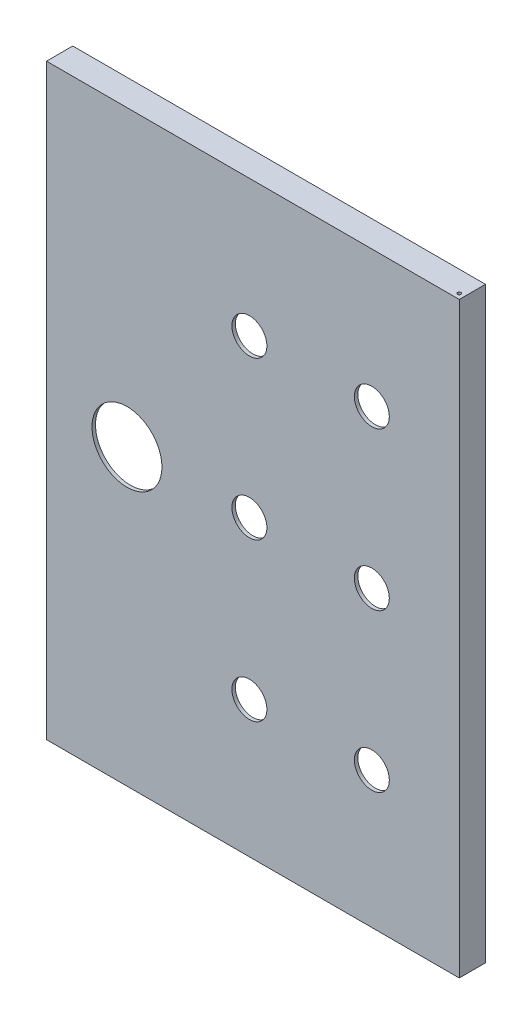
ISO-10303-21;
HEADER;
FILE_DESCRIPTION(('STEP AP214'),'2;1');
FILE_NAME('part.step','',(''),(''),'','','');
FILE_SCHEMA(('AUTOMOTIVE_DESIGN { 1 0 10303 214 1 1 1 1 }'));
ENDSEC;
DATA;
#1=APPLICATION_CONTEXT('core data for automotive mechanical design processes');
#2=APPLICATION_PROTOCOL_DEFINITION('international standard','automotive_design',2000,#1);
#3=PRODUCT_CONTEXT('',#1,'mechanical');
#4=PRODUCT('Part','Part','',(#3));
#5=PRODUCT_RELATED_PRODUCT_CATEGORY('part','',(#4));
#6=PRODUCT_DEFINITION_FORMATION('','',#4);
#7=PRODUCT_DEFINITION_CONTEXT('part definition',#1,'design');
#8=PRODUCT_DEFINITION('design','',#6,#7);
#9=PRODUCT_DEFINITION_SHAPE('','',#8);
#10=(LENGTH_UNIT() NAMED_UNIT(*) SI_UNIT(.MILLI.,.METRE.));
#11=(NAMED_UNIT(*) PLANE_ANGLE_UNIT() SI_UNIT($,.RADIAN.));
#12=(NAMED_UNIT(*) SI_UNIT($,.STERADIAN.) SOLID_ANGLE_UNIT());
#13=UNCERTAINTY_MEASURE_WITH_UNIT(LENGTH_MEASURE(1.E-05),#10,'distance_accuracy_value','');
#14=(GEOMETRIC_REPRESENTATION_CONTEXT(3) GLOBAL_UNCERTAINTY_ASSIGNED_CONTEXT((#13)) GLOBAL_UNIT_ASSIGNED_CONTEXT((#10,
#11,#12)) REPRESENTATION_CONTEXT('',''));
#15=CARTESIAN_POINT('',(0.,0.,0.));
#16=DIRECTION('',(0.,0.,1.));
#17=DIRECTION('',(1.,0.,0.));
#18=AXIS2_PLACEMENT_3D('',#15,#16,#17);
#19=CARTESIAN_POINT('',(-118.,166.,15.));
#20=DIRECTION('',(0.,-1.,0.));
#21=DIRECTION('',(0.,0.,-1.));
#22=AXIS2_PLACEMENT_3D('',#19,#20,#21);
#23=PLANE('',#22);
#24=CARTESIAN_POINT('',(115.,166.,12.));
#25=DIRECTION('',(0.,-1.,0.));
#26=DIRECTION('',(0.,0.,-1.));
#27=AXIS2_PLACEMENT_3D('',#24,#25,#26);
#28=CIRCLE('',#27,0.999999999999998);
#29=CARTESIAN_POINT('',(116.,166.,12.));
#30=VERTEX_POINT('',#29);
#31=CARTESIAN_POINT('',(115.,166.,13.));
#32=VERTEX_POINT('',#31);
#33=EDGE_CURVE('E49',#30,#32,#28,.T.);
#34=ORIENTED_EDGE('',*,*,#33,.F.);
#35=DIRECTION('',(0.,0.,-1.));
#36=VECTOR('',#35,1.);
#37=CARTESIAN_POINT('',(116.,166.,15.));
#38=LINE('',#37,#36);
#39=CARTESIAN_POINT('',(116.,166.,13.));
#40=VERTEX_POINT('',#39);
#41=EDGE_CURVE('E166',#40,#30,#38,.T.);
#42=ORIENTED_EDGE('',*,*,#41,.F.);
#43=DIRECTION('',(-1.,0.,0.));
#44=VECTOR('',#43,1.);
#45=CARTESIAN_POINT('',(-118.,166.,13.));
#46=LINE('',#45,#44);
#47=EDGE_CURVE('E173',#40,#32,#46,.T.);
#48=ORIENTED_EDGE('',*,*,#47,.T.);
#49=EDGE_LOOP('',(#34,#42,#48));
#50=FACE_BOUND('',#49,.T.);
#51=ADVANCED_FACE('F35',(#50),#23,.T.);
#52=CARTESIAN_POINT('',(-118.,-166.,15.));
#53=DIRECTION('',(0.,1.,0.));
#54=DIRECTION('',(-1.,0.,0.));
#55=AXIS2_PLACEMENT_3D('',#52,#53,#54);
#56=PLANE('',#55);
#57=CARTESIAN_POINT('',(115.,-166.,12.));
#58=DIRECTION('',(0.,1.,0.));
#59=DIRECTION('',(-1.,0.,0.));
#60=AXIS2_PLACEMENT_3D('',#57,#58,#59);
#61=CIRCLE('',#60,0.999999999999998);
#62=CARTESIAN_POINT('',(115.,-166.,13.));
#63=VERTEX_POINT('',#62);
#64=CARTESIAN_POINT('',(116.,-166.,12.));
#65=VERTEX_POINT('',#64);
#66=EDGE_CURVE('E11',#63,#65,#61,.T.);
#67=ORIENTED_EDGE('',*,*,#66,.F.);
#68=DIRECTION('',(1.,0.,0.));
#69=VECTOR('',#68,1.);
#70=CARTESIAN_POINT('',(-118.,-166.,13.));
#71=LINE('',#70,#69);
#72=CARTESIAN_POINT('',(116.,-166.,13.));
#73=VERTEX_POINT('',#72);
#74=EDGE_CURVE('E141',#63,#73,#71,.T.);
#75=ORIENTED_EDGE('',*,*,#74,.T.);
#76=DIRECTION('',(0.,0.,-1.));
#77=VECTOR('',#76,1.);
#78=CARTESIAN_POINT('',(116.,-166.,15.));
#79=LINE('',#78,#77);
#80=EDGE_CURVE('E144',#73,#65,#79,.T.);
#81=ORIENTED_EDGE('',*,*,#80,.T.);
#82=EDGE_LOOP('',(#67,#75,#81));
#83=FACE_BOUND('',#82,.T.);
#84=ADVANCED_FACE('F140',(#83),#56,.T.);
#85=CARTESIAN_POINT('',(-118.,-168.,15.));
#86=DIRECTION('',(0.,1.,0.));
#87=DIRECTION('',(-1.,0.,0.));
#88=AXIS2_PLACEMENT_3D('',#85,#86,#87);
#89=PLANE('',#88);
#90=CARTESIAN_POINT('',(115.,-168.,12.));
#91=DIRECTION('',(0.,1.,0.));
#92=DIRECTION('',(0.,0.,1.));
#93=AXIS2_PLACEMENT_3D('',#90,#91,#92);
#94=CIRCLE('',#93,0.999999999999998);
#95=CARTESIAN_POINT('',(115.,-168.,13.));
#96=VERTEX_POINT('',#95);
#97=EDGE_CURVE('E264',#96,#96,#94,.T.);
#98=ORIENTED_EDGE('',*,*,#97,.T.);
#99=EDGE_LOOP('',(#98));
#100=FACE_BOUND('',#99,.T.);
#101=DIRECTION('',(1.,0.,0.));
#102=VECTOR('',#101,1.);
#103=CARTESIAN_POINT('',(-118.,-168.,0.));
#104=LINE('',#103,#102);
#105=CARTESIAN_POINT('',(-118.,-168.,0.));
#106=VERTEX_POINT('',#105);
#107=CARTESIAN_POINT('',(118.,-168.,0.));
#108=VERTEX_POINT('',#107);
#109=EDGE_CURVE('E188',#106,#108,#104,.T.);
#110=ORIENTED_EDGE('',*,*,#109,.T.);
#111=DIRECTION('',(0.,0.,-1.));
#112=VECTOR('',#111,1.);
#113=CARTESIAN_POINT('',(118.,-168.,15.));
#114=LINE('',#113,#112);
#115=CARTESIAN_POINT('',(118.,-168.,15.));
#116=VERTEX_POINT('',#115);
#117=EDGE_CURVE('E136',#116,#108,#114,.T.);
#118=ORIENTED_EDGE('',*,*,#117,.F.);
#119=DIRECTION('',(1.,0.,0.));
#120=VECTOR('',#119,1.);
#121=CARTESIAN_POINT('',(-118.,-168.,15.));
#122=LINE('',#121,#120);
#123=CARTESIAN_POINT('',(-118.,-168.,15.));
#124=VERTEX_POINT('',#123);
#125=EDGE_CURVE('E177',#124,#116,#122,.T.);
#126=ORIENTED_EDGE('',*,*,#125,.F.);
#127=DIRECTION('',(0.,0.,-1.));
#128=VECTOR('',#127,1.);
#129=CARTESIAN_POINT('',(-118.,-168.,15.));
#130=LINE('',#129,#128);
#131=EDGE_CURVE('E187',#124,#106,#130,.T.);
#132=ORIENTED_EDGE('',*,*,#131,.T.);
#133=EDGE_LOOP('',(#110,#118,#126,#132));
#134=FACE_BOUND('',#133,.T.);
#135=ADVANCED_FACE('F37',(#100,#134),#89,.F.);
#136=CARTESIAN_POINT('',(118.,-168.,15.));
#137=DIRECTION('',(-1.,0.,0.));
#138=DIRECTION('',(0.,0.,1.));
#139=AXIS2_PLACEMENT_3D('',#136,#137,#138);
#140=PLANE('',#139);
#141=DIRECTION('',(0.,1.,0.));
#142=VECTOR('',#141,1.);
#143=CARTESIAN_POINT('',(118.,-168.,0.));
#144=LINE('',#143,#142);
#145=CARTESIAN_POINT('',(118.,168.,0.));
#146=VERTEX_POINT('',#145);
#147=EDGE_CURVE('E191',#108,#146,#144,.T.);
#148=ORIENTED_EDGE('',*,*,#147,.T.);
#149=DIRECTION('',(0.,0.,-1.));
#150=VECTOR('',#149,1.);
#151=CARTESIAN_POINT('',(118.,168.,15.));
#152=LINE('',#151,#150);
#153=CARTESIAN_POINT('',(118.,168.,15.));
#154=VERTEX_POINT('',#153);
#155=EDGE_CURVE('E201',#154,#146,#152,.T.);
#156=ORIENTED_EDGE('',*,*,#155,.F.);
#157=DIRECTION('',(0.,1.,0.));
#158=VECTOR('',#157,1.);
#159=CARTESIAN_POINT('',(118.,-168.,15.));
#160=LINE('',#159,#158);
#161=EDGE_CURVE('E180',#116,#154,#160,.T.);
#162=ORIENTED_EDGE('',*,*,#161,.F.);
#163=ORIENTED_EDGE('',*,*,#117,.T.);
#164=EDGE_LOOP('',(#148,#156,#162,#163));
#165=FACE_BOUND('',#164,.T.);
#166=ADVANCED_FACE('F206',(#165),#140,.F.);
#167=CARTESIAN_POINT('',(-118.,168.,15.));
#168=DIRECTION('',(0.,-1.,0.));
#169=DIRECTION('',(0.,0.,-1.));
#170=AXIS2_PLACEMENT_3D('',#167,#168,#169);
#171=PLANE('',#170);
#172=CARTESIAN_POINT('',(115.,168.,12.));
#173=DIRECTION('',(0.,-1.,0.));
#174=DIRECTION('',(0.,0.,-1.));
#175=AXIS2_PLACEMENT_3D('',#172,#173,#174);
#176=CIRCLE('',#175,0.999999999999998);
#177=CARTESIAN_POINT('',(115.,168.,11.));
#178=VERTEX_POINT('',#177);
#179=EDGE_CURVE('E305',#178,#178,#176,.T.);
#180=ORIENTED_EDGE('',*,*,#179,.T.);
#181=EDGE_LOOP('',(#180));
#182=FACE_BOUND('',#181,.T.);
#183=DIRECTION('',(-1.,0.,0.));
#184=VECTOR('',#183,1.);
#185=CARTESIAN_POINT('',(-118.,168.,0.));
#186=LINE('',#185,#184);
#187=CARTESIAN_POINT('',(-118.,168.,0.));
#188=VERTEX_POINT('',#187);
#189=EDGE_CURVE('E193',#146,#188,#186,.T.);
#190=ORIENTED_EDGE('',*,*,#189,.T.);
#191=DIRECTION('',(0.,0.,-1.));
#192=VECTOR('',#191,1.);
#193=CARTESIAN_POINT('',(-118.,168.,15.));
#194=LINE('',#193,#192);
#195=CARTESIAN_POINT('',(-118.,168.,15.));
#196=VERTEX_POINT('',#195);
#197=EDGE_CURVE('E198',#196,#188,#194,.T.);
#198=ORIENTED_EDGE('',*,*,#197,.F.);
#199=DIRECTION('',(-1.,0.,0.));
#200=VECTOR('',#199,1.);
#201=CARTESIAN_POINT('',(-118.,168.,15.));
#202=LINE('',#201,#200);
#203=EDGE_CURVE('E183',#154,#196,#202,.T.);
#204=ORIENTED_EDGE('',*,*,#203,.F.);
#205=ORIENTED_EDGE('',*,*,#155,.T.);
#206=EDGE_LOOP('',(#190,#198,#204,#205));
#207=FACE_BOUND('',#206,.T.);
#208=ADVANCED_FACE('F219',(#182,#207),#171,.F.);
#209=CARTESIAN_POINT('',(-118.,-168.,15.));
#210=DIRECTION('',(1.,0.,0.));
#211=DIRECTION('',(0.,0.,-1.));
#212=AXIS2_PLACEMENT_3D('',#209,#210,#211);
#213=PLANE('',#212);
#214=DIRECTION('',(0.,-1.,0.));
#215=VECTOR('',#214,1.);
#216=CARTESIAN_POINT('',(-118.,-168.,0.));
#217=LINE('',#216,#215);
#218=EDGE_CURVE('E181',#188,#106,#217,.T.);
#219=ORIENTED_EDGE('',*,*,#218,.T.);
#220=ORIENTED_EDGE('',*,*,#131,.F.);
#221=DIRECTION('',(0.,-1.,0.));
#222=VECTOR('',#221,1.);
#223=CARTESIAN_POINT('',(-118.,-168.,15.));
#224=LINE('',#223,#222);
#225=EDGE_CURVE('E185',#196,#124,#224,.T.);
#226=ORIENTED_EDGE('',*,*,#225,.F.);
#227=ORIENTED_EDGE('',*,*,#197,.T.);
#228=EDGE_LOOP('',(#219,#220,#226,#227));
#229=FACE_BOUND('',#228,.T.);
#230=ADVANCED_FACE('F223',(#229),#213,.F.);
#231=CARTESIAN_POINT('',(0.,0.,15.));
#232=DIRECTION('',(0.,0.,1.));
#233=DIRECTION('',(1.,0.,0.));
#234=AXIS2_PLACEMENT_3D('',#231,#232,#233);
#235=PLANE('',#234);
#236=CARTESIAN_POINT('',(68.,-90.0000000000001,15.));
#237=DIRECTION('',(0.,0.,1.));
#238=DIRECTION('',(1.,0.,0.));
#239=AXIS2_PLACEMENT_3D('',#236,#237,#238);
#240=CIRCLE('',#239,9.99999999999999);
#241=CARTESIAN_POINT('',(78.,-90.0000000000001,15.));
#242=VERTEX_POINT('',#241);
#243=EDGE_CURVE('E342',#242,#242,#240,.T.);
#244=ORIENTED_EDGE('',*,*,#243,.F.);
#245=EDGE_LOOP('',(#244));
#246=FACE_BOUND('',#245,.T.);
#247=CARTESIAN_POINT('',(-1.99999999999997,-90.0000000000001,15.));
#248=DIRECTION('',(0.,0.,1.));
#249=DIRECTION('',(1.,0.,0.));
#250=AXIS2_PLACEMENT_3D('',#247,#248,#249);
#251=CIRCLE('',#250,10.);
#252=CARTESIAN_POINT('',(8.00000000000003,-90.0000000000001,15.));
#253=VERTEX_POINT('',#252);
#254=EDGE_CURVE('E348',#253,#253,#251,.T.);
#255=ORIENTED_EDGE('',*,*,#254,.F.);
#256=EDGE_LOOP('',(#255));
#257=FACE_BOUND('',#256,.T.);
#258=CARTESIAN_POINT('',(68.,89.9999999999999,15.));
#259=DIRECTION('',(0.,0.,1.));
#260=DIRECTION('',(1.,0.,0.));
#261=AXIS2_PLACEMENT_3D('',#258,#259,#260);
#262=CIRCLE('',#261,9.99999999999999);
#263=CARTESIAN_POINT('',(78.,89.9999999999999,15.));
#264=VERTEX_POINT('',#263);
#265=EDGE_CURVE('E354',#264,#264,#262,.T.);
#266=ORIENTED_EDGE('',*,*,#265,.F.);
#267=EDGE_LOOP('',(#266));
#268=FACE_BOUND('',#267,.T.);
#269=CARTESIAN_POINT('',(-1.99999999999997,0.,15.));
#270=DIRECTION('',(0.,0.,1.));
#271=DIRECTION('',(1.,0.,0.));
#272=AXIS2_PLACEMENT_3D('',#269,#270,#271);
#273=CIRCLE('',#272,10.);
#274=CARTESIAN_POINT('',(8.00000000000003,0.,15.));
#275=VERTEX_POINT('',#274);
#276=EDGE_CURVE('E324',#275,#275,#273,.T.);
#277=ORIENTED_EDGE('',*,*,#276,.F.);
#278=EDGE_LOOP('',(#277));
#279=FACE_BOUND('',#278,.T.);
#280=CARTESIAN_POINT('',(68.,0.,15.));
#281=DIRECTION('',(0.,0.,1.));
#282=DIRECTION('',(1.,0.,0.));
#283=AXIS2_PLACEMENT_3D('',#280,#281,#282);
#284=CIRCLE('',#283,9.99999999999999);
#285=CARTESIAN_POINT('',(78.,0.,15.));
#286=VERTEX_POINT('',#285);
#287=EDGE_CURVE('E337',#286,#286,#284,.T.);
#288=ORIENTED_EDGE('',*,*,#287,.F.);
#289=EDGE_LOOP('',(#288));
#290=FACE_BOUND('',#289,.T.);
#291=CARTESIAN_POINT('',(-1.99999999999997,89.9999999999999,15.));
#292=DIRECTION('',(0.,0.,1.));
#293=DIRECTION('',(1.,0.,0.));
#294=AXIS2_PLACEMENT_3D('',#291,#292,#293);
#295=CIRCLE('',#294,10.);
#296=CARTESIAN_POINT('',(8.00000000000003,89.9999999999999,15.));
#297=VERTEX_POINT('',#296);
#298=EDGE_CURVE('E330',#297,#297,#295,.T.);
#299=ORIENTED_EDGE('',*,*,#298,.F.);
#300=EDGE_LOOP('',(#299));
#301=FACE_BOUND('',#300,.T.);
#302=CARTESIAN_POINT('',(-72.,0.,15.));
#303=DIRECTION('',(0.,0.,1.));
#304=DIRECTION('',(1.,0.,0.));
#305=AXIS2_PLACEMENT_3D('',#302,#303,#304);
#306=CIRCLE('',#305,20.);
#307=CARTESIAN_POINT('',(-52.,0.,15.));
#308=VERTEX_POINT('',#307);
#309=EDGE_CURVE('E318',#308,#308,#306,.T.);
#310=ORIENTED_EDGE('',*,*,#309,.F.);
#311=EDGE_LOOP('',(#310));
#312=FACE_BOUND('',#311,.T.);
#313=ORIENTED_EDGE('',*,*,#125,.T.);
#314=ORIENTED_EDGE('',*,*,#161,.T.);
#315=ORIENTED_EDGE('',*,*,#203,.T.);
#316=ORIENTED_EDGE('',*,*,#225,.T.);
#317=EDGE_LOOP('',(#313,#314,#315,#316));
#318=FACE_BOUND('',#317,.T.);
#319=ADVANCED_FACE('F225',(#246,#257,#268,#279,#290,#301,#312,#318),#235,.T.);
#320=CARTESIAN_POINT('',(0.,0.,0.));
#321=DIRECTION('',(0.,0.,1.));
#322=DIRECTION('',(1.,0.,0.));
#323=AXIS2_PLACEMENT_3D('',#320,#321,#322);
#324=PLANE('',#323);
#325=ORIENTED_EDGE('',*,*,#109,.F.);
#326=ORIENTED_EDGE('',*,*,#218,.F.);
#327=ORIENTED_EDGE('',*,*,#189,.F.);
#328=ORIENTED_EDGE('',*,*,#147,.F.);
#329=EDGE_LOOP('',(#325,#326,#327,#328));
#330=FACE_BOUND('',#329,.T.);
#331=DIRECTION('',(0.,1.,0.));
#332=VECTOR('',#331,1.);
#333=CARTESIAN_POINT('',(108.,-158.,0.));
#334=LINE('',#333,#332);
#335=CARTESIAN_POINT('',(108.,-158.,0.));
#336=VERTEX_POINT('',#335);
#337=CARTESIAN_POINT('',(108.,158.,0.));
#338=VERTEX_POINT('',#337);
#339=EDGE_CURVE('E302',#336,#338,#334,.T.);
#340=ORIENTED_EDGE('',*,*,#339,.T.);
#341=DIRECTION('',(-1.,0.,0.));
#342=VECTOR('',#341,1.);
#343=CARTESIAN_POINT('',(108.,158.,0.));
#344=LINE('',#343,#342);
#345=CARTESIAN_POINT('',(-108.,158.,0.));
#346=VERTEX_POINT('',#345);
#347=EDGE_CURVE('E299',#338,#346,#344,.T.);
#348=ORIENTED_EDGE('',*,*,#347,.T.);
#349=DIRECTION('',(0.,-1.,0.));
#350=VECTOR('',#349,1.);
#351=CARTESIAN_POINT('',(-108.,158.,0.));
#352=LINE('',#351,#350);
#353=CARTESIAN_POINT('',(-108.,-158.,0.));
#354=VERTEX_POINT('',#353);
#355=EDGE_CURVE('E296',#346,#354,#352,.T.);
#356=ORIENTED_EDGE('',*,*,#355,.T.);
#357=DIRECTION('',(1.,0.,0.));
#358=VECTOR('',#357,1.);
#359=CARTESIAN_POINT('',(-108.,-158.,0.));
#360=LINE('',#359,#358);
#361=EDGE_CURVE('E292',#354,#336,#360,.T.);
#362=ORIENTED_EDGE('',*,*,#361,.T.);
#363=EDGE_LOOP('',(#340,#348,#356,#362));
#364=FACE_BOUND('',#363,.T.);
#365=ADVANCED_FACE('F214',(#330,#364),#324,.F.);
#366=CARTESIAN_POINT('',(0.,0.,2.));
#367=DIRECTION('',(0.,0.,1.));
#368=DIRECTION('',(1.,0.,0.));
#369=AXIS2_PLACEMENT_3D('',#366,#367,#368);
#370=PLANE('',#369);
#371=DIRECTION('',(-1.,0.,0.));
#372=VECTOR('',#371,1.);
#373=CARTESIAN_POINT('',(116.,166.,2.));
#374=LINE('',#373,#372);
#375=CARTESIAN_POINT('',(116.,166.,2.));
#376=VERTEX_POINT('',#375);
#377=CARTESIAN_POINT('',(-116.,166.,2.));
#378=VERTEX_POINT('',#377);
#379=EDGE_CURVE('E277',#376,#378,#374,.T.);
#380=ORIENTED_EDGE('',*,*,#379,.T.);
#381=DIRECTION('',(0.,-1.,0.));
#382=VECTOR('',#381,1.);
#383=CARTESIAN_POINT('',(-116.,166.,2.));
#384=LINE('',#383,#382);
#385=CARTESIAN_POINT('',(-116.,-166.,2.));
#386=VERTEX_POINT('',#385);
#387=EDGE_CURVE('E275',#378,#386,#384,.T.);
#388=ORIENTED_EDGE('',*,*,#387,.T.);
#389=DIRECTION('',(1.,0.,0.));
#390=VECTOR('',#389,1.);
#391=CARTESIAN_POINT('',(-116.,-166.,2.));
#392=LINE('',#391,#390);
#393=CARTESIAN_POINT('',(116.,-166.,2.));
#394=VERTEX_POINT('',#393);
#395=EDGE_CURVE('E269',#386,#394,#392,.T.);
#396=ORIENTED_EDGE('',*,*,#395,.T.);
#397=DIRECTION('',(0.,1.,0.));
#398=VECTOR('',#397,1.);
#399=CARTESIAN_POINT('',(116.,-166.,2.));
#400=LINE('',#399,#398);
#401=EDGE_CURVE('E152',#394,#376,#400,.T.);
#402=ORIENTED_EDGE('',*,*,#401,.T.);
#403=EDGE_LOOP('',(#380,#388,#396,#402));
#404=FACE_BOUND('',#403,.T.);
#405=DIRECTION('',(-1.,0.,0.));
#406=VECTOR('',#405,1.);
#407=CARTESIAN_POINT('',(108.,158.,2.));
#408=LINE('',#407,#406);
#409=CARTESIAN_POINT('',(108.,158.,2.));
#410=VERTEX_POINT('',#409);
#411=CARTESIAN_POINT('',(-108.,158.,2.));
#412=VERTEX_POINT('',#411);
#413=EDGE_CURVE('E310',#410,#412,#408,.T.);
#414=ORIENTED_EDGE('',*,*,#413,.F.);
#415=DIRECTION('',(0.,1.,0.));
#416=VECTOR('',#415,1.);
#417=CARTESIAN_POINT('',(108.,-158.,2.));
#418=LINE('',#417,#416);
#419=CARTESIAN_POINT('',(108.,-158.,2.));
#420=VERTEX_POINT('',#419);
#421=EDGE_CURVE('E295',#420,#410,#418,.T.);
#422=ORIENTED_EDGE('',*,*,#421,.F.);
#423=DIRECTION('',(1.,0.,0.));
#424=VECTOR('',#423,1.);
#425=CARTESIAN_POINT('',(-108.,-158.,2.));
#426=LINE('',#425,#424);
#427=CARTESIAN_POINT('',(-108.,-158.,2.));
#428=VERTEX_POINT('',#427);
#429=EDGE_CURVE('E291',#428,#420,#426,.T.);
#430=ORIENTED_EDGE('',*,*,#429,.F.);
#431=DIRECTION('',(0.,-1.,0.));
#432=VECTOR('',#431,1.);
#433=CARTESIAN_POINT('',(-108.,158.,2.));
#434=LINE('',#433,#432);
#435=EDGE_CURVE('E307',#412,#428,#434,.T.);
#436=ORIENTED_EDGE('',*,*,#435,.F.);
#437=EDGE_LOOP('',(#414,#422,#430,#436));
#438=FACE_BOUND('',#437,.T.);
#439=ADVANCED_FACE('F233',(#404,#438),#370,.T.);
#440=CARTESIAN_POINT('',(108.,-158.,2.));
#441=DIRECTION('',(-1.,0.,0.));
#442=DIRECTION('',(0.,0.,1.));
#443=AXIS2_PLACEMENT_3D('',#440,#441,#442);
#444=PLANE('',#443);
#445=ORIENTED_EDGE('',*,*,#339,.F.);
#446=DIRECTION('',(0.,0.,-1.));
#447=VECTOR('',#446,1.);
#448=CARTESIAN_POINT('',(108.,-158.,2.));
#449=LINE('',#448,#447);
#450=EDGE_CURVE('E288',#420,#336,#449,.T.);
#451=ORIENTED_EDGE('',*,*,#450,.F.);
#452=ORIENTED_EDGE('',*,*,#421,.T.);
#453=DIRECTION('',(0.,0.,-1.));
#454=VECTOR('',#453,1.);
#455=CARTESIAN_POINT('',(108.,158.,2.));
#456=LINE('',#455,#454);
#457=EDGE_CURVE('E281',#410,#338,#456,.T.);
#458=ORIENTED_EDGE('',*,*,#457,.T.);
#459=EDGE_LOOP('',(#445,#451,#452,#458));
#460=FACE_BOUND('',#459,.T.);
#461=ADVANCED_FACE('F408',(#460),#444,.T.);
#462=CARTESIAN_POINT('',(108.,158.,2.));
#463=DIRECTION('',(0.,-1.,0.));
#464=DIRECTION('',(0.,0.,-1.));
#465=AXIS2_PLACEMENT_3D('',#462,#463,#464);
#466=PLANE('',#465);
#467=ORIENTED_EDGE('',*,*,#347,.F.);
#468=ORIENTED_EDGE('',*,*,#457,.F.);
#469=ORIENTED_EDGE('',*,*,#413,.T.);
#470=DIRECTION('',(0.,0.,-1.));
#471=VECTOR('',#470,1.);
#472=CARTESIAN_POINT('',(-108.,158.,2.));
#473=LINE('',#472,#471);
#474=EDGE_CURVE('E284',#412,#346,#473,.T.);
#475=ORIENTED_EDGE('',*,*,#474,.T.);
#476=EDGE_LOOP('',(#467,#468,#469,#475));
#477=FACE_BOUND('',#476,.T.);
#478=ADVANCED_FACE('F404',(#477),#466,.T.);
#479=CARTESIAN_POINT('',(-108.,158.,2.));
#480=DIRECTION('',(1.,0.,0.));
#481=DIRECTION('',(0.,0.,-1.));
#482=AXIS2_PLACEMENT_3D('',#479,#480,#481);
#483=PLANE('',#482);
#484=ORIENTED_EDGE('',*,*,#355,.F.);
#485=ORIENTED_EDGE('',*,*,#474,.F.);
#486=ORIENTED_EDGE('',*,*,#435,.T.);
#487=DIRECTION('',(0.,0.,-1.));
#488=VECTOR('',#487,1.);
#489=CARTESIAN_POINT('',(-108.,-158.,2.));
#490=LINE('',#489,#488);
#491=EDGE_CURVE('E286',#428,#354,#490,.T.);
#492=ORIENTED_EDGE('',*,*,#491,.T.);
#493=EDGE_LOOP('',(#484,#485,#486,#492));
#494=FACE_BOUND('',#493,.T.);
#495=ADVANCED_FACE('F400',(#494),#483,.T.);
#496=CARTESIAN_POINT('',(-108.,-158.,2.));
#497=DIRECTION('',(0.,1.,0.));
#498=DIRECTION('',(0.,0.,1.));
#499=AXIS2_PLACEMENT_3D('',#496,#497,#498);
#500=PLANE('',#499);
#501=ORIENTED_EDGE('',*,*,#361,.F.);
#502=ORIENTED_EDGE('',*,*,#491,.F.);
#503=ORIENTED_EDGE('',*,*,#429,.T.);
#504=ORIENTED_EDGE('',*,*,#450,.T.);
#505=EDGE_LOOP('',(#501,#502,#503,#504));
#506=FACE_BOUND('',#505,.T.);
#507=ADVANCED_FACE('F397',(#506),#500,.T.);
#508=CARTESIAN_POINT('',(0.,0.,13.));
#509=DIRECTION('',(0.,0.,1.));
#510=DIRECTION('',(1.,0.,0.));
#511=AXIS2_PLACEMENT_3D('',#508,#509,#510);
#512=PLANE('',#511);
#513=CARTESIAN_POINT('',(68.,-90.0000000000001,13.));
#514=DIRECTION('',(0.,0.,1.));
#515=DIRECTION('',(1.,0.,0.));
#516=AXIS2_PLACEMENT_3D('',#513,#514,#515);
#517=CIRCLE('',#516,9.99999999999999);
#518=CARTESIAN_POINT('',(78.,-90.0000000000001,13.));
#519=VERTEX_POINT('',#518);
#520=EDGE_CURVE('E345',#519,#519,#517,.T.);
#521=ORIENTED_EDGE('',*,*,#520,.T.);
#522=EDGE_LOOP('',(#521));
#523=FACE_BOUND('',#522,.T.);
#524=CARTESIAN_POINT('',(-1.99999999999997,-90.0000000000001,13.));
#525=DIRECTION('',(0.,0.,1.));
#526=DIRECTION('',(1.,0.,0.));
#527=AXIS2_PLACEMENT_3D('',#524,#525,#526);
#528=CIRCLE('',#527,10.);
#529=CARTESIAN_POINT('',(8.00000000000003,-90.0000000000001,13.));
#530=VERTEX_POINT('',#529);
#531=EDGE_CURVE('E351',#530,#530,#528,.T.);
#532=ORIENTED_EDGE('',*,*,#531,.T.);
#533=EDGE_LOOP('',(#532));
#534=FACE_BOUND('',#533,.T.);
#535=CARTESIAN_POINT('',(68.,89.9999999999999,13.));
#536=DIRECTION('',(0.,0.,1.));
#537=DIRECTION('',(1.,0.,0.));
#538=AXIS2_PLACEMENT_3D('',#535,#536,#537);
#539=CIRCLE('',#538,9.99999999999999);
#540=CARTESIAN_POINT('',(78.,89.9999999999999,13.));
#541=VERTEX_POINT('',#540);
#542=EDGE_CURVE('E334',#541,#541,#539,.T.);
#543=ORIENTED_EDGE('',*,*,#542,.T.);
#544=EDGE_LOOP('',(#543));
#545=FACE_BOUND('',#544,.T.);
#546=CARTESIAN_POINT('',(-1.99999999999997,0.,13.));
#547=DIRECTION('',(0.,0.,1.));
#548=DIRECTION('',(1.,0.,0.));
#549=AXIS2_PLACEMENT_3D('',#546,#547,#548);
#550=CIRCLE('',#549,10.);
#551=CARTESIAN_POINT('',(8.00000000000003,0.,13.));
#552=VERTEX_POINT('',#551);
#553=EDGE_CURVE('E321',#552,#552,#550,.T.);
#554=ORIENTED_EDGE('',*,*,#553,.T.);
#555=EDGE_LOOP('',(#554));
#556=FACE_BOUND('',#555,.T.);
#557=CARTESIAN_POINT('',(68.,0.,13.));
#558=DIRECTION('',(0.,0.,1.));
#559=DIRECTION('',(1.,0.,0.));
#560=AXIS2_PLACEMENT_3D('',#557,#558,#559);
#561=CIRCLE('',#560,9.99999999999999);
#562=CARTESIAN_POINT('',(78.,0.,13.));
#563=VERTEX_POINT('',#562);
#564=EDGE_CURVE('E327',#563,#563,#561,.T.);
#565=ORIENTED_EDGE('',*,*,#564,.T.);
#566=EDGE_LOOP('',(#565));
#567=FACE_BOUND('',#566,.T.);
#568=CARTESIAN_POINT('',(-1.99999999999997,89.9999999999999,13.));
#569=DIRECTION('',(0.,0.,1.));
#570=DIRECTION('',(1.,0.,0.));
#571=AXIS2_PLACEMENT_3D('',#568,#569,#570);
#572=CIRCLE('',#571,10.);
#573=CARTESIAN_POINT('',(8.00000000000003,89.9999999999999,13.));
#574=VERTEX_POINT('',#573);
#575=EDGE_CURVE('E333',#574,#574,#572,.T.);
#576=ORIENTED_EDGE('',*,*,#575,.T.);
#577=EDGE_LOOP('',(#576));
#578=FACE_BOUND('',#577,.T.);
#579=CARTESIAN_POINT('',(-72.,0.,13.));
#580=DIRECTION('',(0.,0.,1.));
#581=DIRECTION('',(1.,0.,0.));
#582=AXIS2_PLACEMENT_3D('',#579,#580,#581);
#583=CIRCLE('',#582,20.);
#584=CARTESIAN_POINT('',(-52.,0.,13.));
#585=VERTEX_POINT('',#584);
#586=EDGE_CURVE('E317',#585,#585,#583,.T.);
#587=ORIENTED_EDGE('',*,*,#586,.T.);
#588=EDGE_LOOP('',(#587));
#589=FACE_BOUND('',#588,.T.);
#590=ORIENTED_EDGE('',*,*,#74,.F.);
#591=CARTESIAN_POINT('',(-116.,-166.,13.));
#592=VERTEX_POINT('',#591);
#593=EDGE_CURVE('E149',#592,#63,#71,.T.);
#594=ORIENTED_EDGE('',*,*,#593,.F.);
#595=DIRECTION('',(0.,-1.,0.));
#596=VECTOR('',#595,1.);
#597=CARTESIAN_POINT('',(-116.,-168.,13.));
#598=LINE('',#597,#596);
#599=CARTESIAN_POINT('',(-116.,166.,13.));
#600=VERTEX_POINT('',#599);
#601=EDGE_CURVE('E165',#600,#592,#598,.T.);
#602=ORIENTED_EDGE('',*,*,#601,.F.);
#603=EDGE_CURVE('E158',#32,#600,#46,.T.);
#604=ORIENTED_EDGE('',*,*,#603,.F.);
#605=ORIENTED_EDGE('',*,*,#47,.F.);
#606=DIRECTION('',(0.,1.,0.));
#607=VECTOR('',#606,1.);
#608=CARTESIAN_POINT('',(116.,-168.,13.));
#609=LINE('',#608,#607);
#610=EDGE_CURVE('E151',#73,#40,#609,.T.);
#611=ORIENTED_EDGE('',*,*,#610,.F.);
#612=EDGE_LOOP('',(#590,#594,#602,#604,#605,#611));
#613=FACE_BOUND('',#612,.T.);
#614=ADVANCED_FACE('F147',(#523,#534,#545,#556,#567,#578,#589,#613),#512,.F.);
#615=CARTESIAN_POINT('',(-116.,-168.,15.));
#616=DIRECTION('',(1.,0.,0.));
#617=DIRECTION('',(0.,0.,-1.));
#618=AXIS2_PLACEMENT_3D('',#615,#616,#617);
#619=PLANE('',#618);
#620=ORIENTED_EDGE('',*,*,#387,.F.);
#621=DIRECTION('',(0.,0.,-1.));
#622=VECTOR('',#621,1.);
#623=CARTESIAN_POINT('',(-116.,166.,15.));
#624=LINE('',#623,#622);
#625=EDGE_CURVE('E164',#600,#378,#624,.T.);
#626=ORIENTED_EDGE('',*,*,#625,.F.);
#627=ORIENTED_EDGE('',*,*,#601,.T.);
#628=DIRECTION('',(0.,0.,-1.));
#629=VECTOR('',#628,1.);
#630=CARTESIAN_POINT('',(-116.,-166.,15.));
#631=LINE('',#630,#629);
#632=EDGE_CURVE('E157',#592,#386,#631,.T.);
#633=ORIENTED_EDGE('',*,*,#632,.T.);
#634=EDGE_LOOP('',(#620,#626,#627,#633));
#635=FACE_BOUND('',#634,.T.);
#636=ADVANCED_FACE('F251',(#635),#619,.T.);
#637=EDGE_CURVE('E260',#32,#30,#28,.T.);
#638=ORIENTED_EDGE('',*,*,#637,.F.);
#639=ORIENTED_EDGE('',*,*,#603,.T.);
#640=ORIENTED_EDGE('',*,*,#625,.T.);
#641=ORIENTED_EDGE('',*,*,#379,.F.);
#642=EDGE_CURVE('E169',#30,#376,#38,.T.);
#643=ORIENTED_EDGE('',*,*,#642,.F.);
#644=EDGE_LOOP('',(#638,#639,#640,#641,#643));
#645=FACE_BOUND('',#644,.T.);
#646=ADVANCED_FACE('F242',(#645),#23,.T.);
#647=CARTESIAN_POINT('',(116.,-168.,15.));
#648=DIRECTION('',(-1.,0.,0.));
#649=DIRECTION('',(0.,0.,1.));
#650=AXIS2_PLACEMENT_3D('',#647,#648,#649);
#651=PLANE('',#650);
#652=ORIENTED_EDGE('',*,*,#41,.T.);
#653=ORIENTED_EDGE('',*,*,#642,.T.);
#654=ORIENTED_EDGE('',*,*,#401,.F.);
#655=EDGE_CURVE('E168',#65,#394,#79,.T.);
#656=ORIENTED_EDGE('',*,*,#655,.F.);
#657=ORIENTED_EDGE('',*,*,#80,.F.);
#658=ORIENTED_EDGE('',*,*,#610,.T.);
#659=EDGE_LOOP('',(#652,#653,#654,#656,#657,#658));
#660=FACE_BOUND('',#659,.T.);
#661=ADVANCED_FACE('F250',(#660),#651,.T.);
#662=EDGE_CURVE('E39',#65,#63,#61,.T.);
#663=ORIENTED_EDGE('',*,*,#662,.F.);
#664=ORIENTED_EDGE('',*,*,#655,.T.);
#665=ORIENTED_EDGE('',*,*,#395,.F.);
#666=ORIENTED_EDGE('',*,*,#632,.F.);
#667=ORIENTED_EDGE('',*,*,#593,.T.);
#668=EDGE_LOOP('',(#663,#664,#665,#666,#667));
#669=FACE_BOUND('',#668,.T.);
#670=ADVANCED_FACE('F155',(#669),#56,.T.);
#671=CARTESIAN_POINT('',(115.,-168.,12.));
#672=DIRECTION('',(0.,1.,0.));
#673=DIRECTION('',(0.,0.,1.));
#674=AXIS2_PLACEMENT_3D('',#671,#672,#673);
#675=CYLINDRICAL_SURFACE('',#674,0.999999999999998);
#676=ORIENTED_EDGE('',*,*,#66,.T.);
#677=ORIENTED_EDGE('',*,*,#662,.T.);
#678=EDGE_LOOP('',(#676,#677));
#679=FACE_BOUND('',#678,.T.);
#680=ORIENTED_EDGE('',*,*,#97,.F.);
#681=EDGE_LOOP('',(#680));
#682=FACE_BOUND('',#681,.T.);
#683=ADVANCED_FACE('F131',(#679,#682),#675,.F.);
#684=ORIENTED_EDGE('',*,*,#33,.T.);
#685=ORIENTED_EDGE('',*,*,#637,.T.);
#686=EDGE_LOOP('',(#684,#685));
#687=FACE_BOUND('',#686,.T.);
#688=ORIENTED_EDGE('',*,*,#179,.F.);
#689=EDGE_LOOP('',(#688));
#690=FACE_BOUND('',#689,.T.);
#691=ADVANCED_FACE('F382',(#687,#690),#675,.F.);
#692=CARTESIAN_POINT('',(-72.,0.,13.));
#693=DIRECTION('',(0.,0.,1.));
#694=DIRECTION('',(1.,0.,0.));
#695=AXIS2_PLACEMENT_3D('',#692,#693,#694);
#696=CYLINDRICAL_SURFACE('',#695,20.);
#697=ORIENTED_EDGE('',*,*,#586,.F.);
#698=EDGE_LOOP('',(#697));
#699=FACE_BOUND('',#698,.T.);
#700=ORIENTED_EDGE('',*,*,#309,.T.);
#701=EDGE_LOOP('',(#700));
#702=FACE_BOUND('',#701,.T.);
#703=ADVANCED_FACE('F379',(#699,#702),#696,.F.);
#704=CARTESIAN_POINT('',(-1.99999999999997,89.9999999999999,13.));
#705=DIRECTION('',(0.,0.,1.));
#706=DIRECTION('',(1.,0.,0.));
#707=AXIS2_PLACEMENT_3D('',#704,#705,#706);
#708=CYLINDRICAL_SURFACE('',#707,10.);
#709=ORIENTED_EDGE('',*,*,#575,.F.);
#710=EDGE_LOOP('',(#709));
#711=FACE_BOUND('',#710,.T.);
#712=ORIENTED_EDGE('',*,*,#298,.T.);
#713=EDGE_LOOP('',(#712));
#714=FACE_BOUND('',#713,.T.);
#715=ADVANCED_FACE('F381',(#711,#714),#708,.F.);
#716=CARTESIAN_POINT('',(68.,0.,13.));
#717=DIRECTION('',(0.,0.,1.));
#718=DIRECTION('',(1.,0.,0.));
#719=AXIS2_PLACEMENT_3D('',#716,#717,#718);
#720=CYLINDRICAL_SURFACE('',#719,9.99999999999999);
#721=ORIENTED_EDGE('',*,*,#564,.F.);
#722=EDGE_LOOP('',(#721));
#723=FACE_BOUND('',#722,.T.);
#724=ORIENTED_EDGE('',*,*,#287,.T.);
#725=EDGE_LOOP('',(#724));
#726=FACE_BOUND('',#725,.T.);
#727=ADVANCED_FACE('F389',(#723,#726),#720,.F.);
#728=CARTESIAN_POINT('',(-1.99999999999997,0.,13.));
#729=DIRECTION('',(0.,0.,1.));
#730=DIRECTION('',(1.,0.,0.));
#731=AXIS2_PLACEMENT_3D('',#728,#729,#730);
#732=CYLINDRICAL_SURFACE('',#731,10.);
#733=ORIENTED_EDGE('',*,*,#553,.F.);
#734=EDGE_LOOP('',(#733));
#735=FACE_BOUND('',#734,.T.);
#736=ORIENTED_EDGE('',*,*,#276,.T.);
#737=EDGE_LOOP('',(#736));
#738=FACE_BOUND('',#737,.T.);
#739=ADVANCED_FACE('F366',(#735,#738),#732,.F.);
#740=CARTESIAN_POINT('',(68.,89.9999999999999,13.));
#741=DIRECTION('',(0.,0.,1.));
#742=DIRECTION('',(1.,0.,0.));
#743=AXIS2_PLACEMENT_3D('',#740,#741,#742);
#744=CYLINDRICAL_SURFACE('',#743,9.99999999999999);
#745=ORIENTED_EDGE('',*,*,#542,.F.);
#746=EDGE_LOOP('',(#745));
#747=FACE_BOUND('',#746,.T.);
#748=ORIENTED_EDGE('',*,*,#265,.T.);
#749=EDGE_LOOP('',(#748));
#750=FACE_BOUND('',#749,.T.);
#751=ADVANCED_FACE('F362',(#747,#750),#744,.F.);
#752=CARTESIAN_POINT('',(-1.99999999999997,-90.0000000000001,13.));
#753=DIRECTION('',(0.,0.,1.));
#754=DIRECTION('',(1.,0.,0.));
#755=AXIS2_PLACEMENT_3D('',#752,#753,#754);
#756=CYLINDRICAL_SURFACE('',#755,10.);
#757=ORIENTED_EDGE('',*,*,#531,.F.);
#758=EDGE_LOOP('',(#757));
#759=FACE_BOUND('',#758,.T.);
#760=ORIENTED_EDGE('',*,*,#254,.T.);
#761=EDGE_LOOP('',(#760));
#762=FACE_BOUND('',#761,.T.);
#763=ADVANCED_FACE('F365',(#759,#762),#756,.F.);
#764=CARTESIAN_POINT('',(68.,-90.0000000000001,13.));
#765=DIRECTION('',(0.,0.,1.));
#766=DIRECTION('',(1.,0.,0.));
#767=AXIS2_PLACEMENT_3D('',#764,#765,#766);
#768=CYLINDRICAL_SURFACE('',#767,9.99999999999999);
#769=ORIENTED_EDGE('',*,*,#520,.F.);
#770=EDGE_LOOP('',(#769));
#771=FACE_BOUND('',#770,.T.);
#772=ORIENTED_EDGE('',*,*,#243,.T.);
#773=EDGE_LOOP('',(#772));
#774=FACE_BOUND('',#773,.T.);
#775=ADVANCED_FACE('F485',(#771,#774),#768,.F.);
#776=CLOSED_SHELL('',(#51,#84,#135,#166,#208,#230,#319,#365,#439,#461,#478,#495,#507,#614,#636,
#646,#661,#670,#683,#691,#703,#715,#727,#739,#751,#763,#775));
#777=MANIFOLD_SOLID_BREP('B2',#776);
#778=ADVANCED_BREP_SHAPE_REPRESENTATION('',(#18,#777),#14);
#779=SHAPE_DEFINITION_REPRESENTATION(#9,#778);
ENDSEC;
END-ISO-10303-21;
